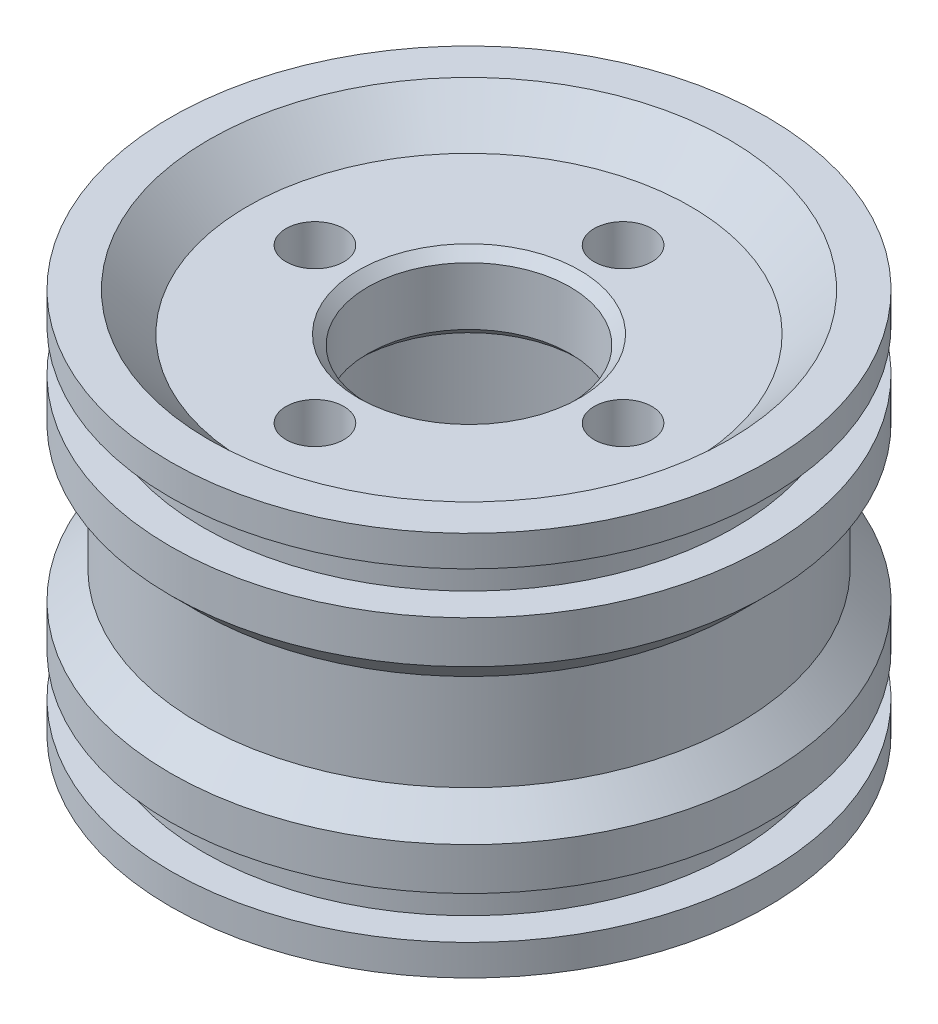
ISO-10303-21;
HEADER;
FILE_DESCRIPTION(('STEP AP214'),'2;1');
FILE_NAME('part.step','',(''),(''),'','','');
FILE_SCHEMA(('AUTOMOTIVE_DESIGN { 1 0 10303 214 1 1 1 1 }'));
ENDSEC;
DATA;
#1=APPLICATION_CONTEXT('core data for automotive mechanical design processes');
#2=APPLICATION_PROTOCOL_DEFINITION('international standard','automotive_design',2000,#1);
#3=PRODUCT_CONTEXT('',#1,'mechanical');
#4=PRODUCT('Part','Part','',(#3));
#5=PRODUCT_RELATED_PRODUCT_CATEGORY('part','',(#4));
#6=PRODUCT_DEFINITION_FORMATION('','',#4);
#7=PRODUCT_DEFINITION_CONTEXT('part definition',#1,'design');
#8=PRODUCT_DEFINITION('design','',#6,#7);
#9=PRODUCT_DEFINITION_SHAPE('','',#8);
#10=(LENGTH_UNIT() NAMED_UNIT(*) SI_UNIT(.MILLI.,.METRE.));
#11=(NAMED_UNIT(*) PLANE_ANGLE_UNIT() SI_UNIT($,.RADIAN.));
#12=(NAMED_UNIT(*) SI_UNIT($,.STERADIAN.) SOLID_ANGLE_UNIT());
#13=UNCERTAINTY_MEASURE_WITH_UNIT(LENGTH_MEASURE(1.E-05),#10,'distance_accuracy_value','');
#14=(GEOMETRIC_REPRESENTATION_CONTEXT(3) GLOBAL_UNCERTAINTY_ASSIGNED_CONTEXT((#13)) GLOBAL_UNIT_ASSIGNED_CONTEXT((#10,
#11,#12)) REPRESENTATION_CONTEXT('',''));
#15=CARTESIAN_POINT('',(0.,0.,0.));
#16=DIRECTION('',(0.,0.,1.));
#17=DIRECTION('',(1.,0.,0.));
#18=AXIS2_PLACEMENT_3D('',#15,#16,#17);
#19=CARTESIAN_POINT('',(0.,10.,0.));
#20=DIRECTION('',(0.,-1.,0.));
#21=DIRECTION('',(0.,0.,-1.));
#22=AXIS2_PLACEMENT_3D('',#19,#20,#21);
#23=CYLINDRICAL_SURFACE('',#22,15.5);
#24=CARTESIAN_POINT('',(0.,-4.,0.));
#25=DIRECTION('',(0.,-1.,0.));
#26=DIRECTION('',(0.,0.,-1.));
#27=AXIS2_PLACEMENT_3D('',#24,#25,#26);
#28=CIRCLE('',#27,15.5);
#29=CARTESIAN_POINT('',(0.,-4.,-15.5));
#30=VERTEX_POINT('',#29);
#31=EDGE_CURVE('E136',#30,#30,#28,.T.);
#32=ORIENTED_EDGE('',*,*,#31,.T.);
#33=EDGE_LOOP('',(#32));
#34=FACE_BOUND('',#33,.T.);
#35=CARTESIAN_POINT('',(0.,-6.2,0.));
#36=DIRECTION('',(0.,1.,0.));
#37=DIRECTION('',(0.,0.,1.));
#38=AXIS2_PLACEMENT_3D('',#35,#36,#37);
#39=CIRCLE('',#38,15.5);
#40=CARTESIAN_POINT('',(0.,-6.2,15.5));
#41=VERTEX_POINT('',#40);
#42=EDGE_CURVE('E116',#41,#41,#39,.T.);
#43=ORIENTED_EDGE('',*,*,#42,.T.);
#44=EDGE_LOOP('',(#43));
#45=FACE_BOUND('',#44,.T.);
#46=ADVANCED_FACE('F41',(#34,#45),#23,.T.);
#47=CARTESIAN_POINT('',(0.,-5.,0.));
#48=DIRECTION('',(0.,1.,0.));
#49=DIRECTION('',(0.,0.,1.));
#50=AXIS2_PLACEMENT_3D('',#47,#48,#49);
#51=CYLINDRICAL_SURFACE('',#50,5.25);
#52=CARTESIAN_POINT('',(0.,7.5,0.));
#53=DIRECTION('',(0.,1.,0.));
#54=DIRECTION('',(0.,0.,1.));
#55=AXIS2_PLACEMENT_3D('',#52,#53,#54);
#56=CIRCLE('',#55,5.25);
#57=CARTESIAN_POINT('',(0.,7.5,5.25));
#58=VERTEX_POINT('',#57);
#59=EDGE_CURVE('E57',#58,#58,#56,.T.);
#60=ORIENTED_EDGE('',*,*,#59,.T.);
#61=EDGE_LOOP('',(#60));
#62=FACE_BOUND('',#61,.T.);
#63=CARTESIAN_POINT('',(0.,4.5,0.));
#64=DIRECTION('',(0.,-1.,0.));
#65=DIRECTION('',(0.,0.,-1.));
#66=AXIS2_PLACEMENT_3D('',#63,#64,#65);
#67=CIRCLE('',#66,5.25);
#68=CARTESIAN_POINT('',(0.,4.5,-5.25));
#69=VERTEX_POINT('',#68);
#70=EDGE_CURVE('E62',#69,#69,#67,.T.);
#71=ORIENTED_EDGE('',*,*,#70,.T.);
#72=EDGE_LOOP('',(#71));
#73=FACE_BOUND('',#72,.T.);
#74=ADVANCED_FACE('F154',(#62,#73),#51,.F.);
#75=CARTESIAN_POINT('',(0.,4.,0.));
#76=DIRECTION('',(0.,-1.,0.));
#77=DIRECTION('',(0.,0.,-1.));
#78=AXIS2_PLACEMENT_3D('',#75,#76,#77);
#79=CIRCLE('',#78,15.5);
#80=CARTESIAN_POINT('',(0.,4.,-15.5));
#81=VERTEX_POINT('',#80);
#82=EDGE_CURVE('E143',#81,#81,#79,.T.);
#83=ORIENTED_EDGE('',*,*,#82,.F.);
#84=EDGE_LOOP('',(#83));
#85=FACE_BOUND('',#84,.T.);
#86=CARTESIAN_POINT('',(0.,6.2,0.));
#87=DIRECTION('',(0.,1.,0.));
#88=DIRECTION('',(0.,0.,1.));
#89=AXIS2_PLACEMENT_3D('',#86,#87,#88);
#90=CIRCLE('',#89,15.5);
#91=CARTESIAN_POINT('',(0.,6.2,15.5));
#92=VERTEX_POINT('',#91);
#93=EDGE_CURVE('E102',#92,#92,#90,.T.);
#94=ORIENTED_EDGE('',*,*,#93,.F.);
#95=EDGE_LOOP('',(#94));
#96=FACE_BOUND('',#95,.T.);
#97=ADVANCED_FACE('F150',(#85,#96),#23,.T.);
#98=CARTESIAN_POINT('',(15.5,6.2,0.));
#99=DIRECTION('',(0.,1.,0.));
#100=DIRECTION('',(0.,0.,1.));
#101=AXIS2_PLACEMENT_3D('',#98,#99,#100);
#102=PLANE('',#101);
#103=ORIENTED_EDGE('',*,*,#93,.T.);
#104=EDGE_LOOP('',(#103));
#105=FACE_BOUND('',#104,.T.);
#106=CARTESIAN_POINT('',(0.,6.2,0.));
#107=DIRECTION('',(0.,1.,0.));
#108=DIRECTION('',(0.,0.,1.));
#109=AXIS2_PLACEMENT_3D('',#106,#107,#108);
#110=CIRCLE('',#109,13.8);
#111=CARTESIAN_POINT('',(0.,6.2,13.8));
#112=VERTEX_POINT('',#111);
#113=EDGE_CURVE('E107',#112,#112,#110,.T.);
#114=ORIENTED_EDGE('',*,*,#113,.F.);
#115=EDGE_LOOP('',(#114));
#116=FACE_BOUND('',#115,.T.);
#117=ADVANCED_FACE('F153',(#105,#116),#102,.T.);
#118=CARTESIAN_POINT('',(0.,8.4,0.));
#119=DIRECTION('',(0.,1.,0.));
#120=DIRECTION('',(0.,0.,1.));
#121=AXIS2_PLACEMENT_3D('',#118,#119,#120);
#122=CYLINDRICAL_SURFACE('',#121,13.8);
#123=ORIENTED_EDGE('',*,*,#113,.T.);
#124=EDGE_LOOP('',(#123));
#125=FACE_BOUND('',#124,.T.);
#126=CARTESIAN_POINT('',(0.,8.4,0.));
#127=DIRECTION('',(0.,1.,0.));
#128=DIRECTION('',(0.,0.,1.));
#129=AXIS2_PLACEMENT_3D('',#126,#127,#128);
#130=CIRCLE('',#129,13.8);
#131=CARTESIAN_POINT('',(0.,8.4,13.8));
#132=VERTEX_POINT('',#131);
#133=EDGE_CURVE('E110',#132,#132,#130,.T.);
#134=ORIENTED_EDGE('',*,*,#133,.F.);
#135=EDGE_LOOP('',(#134));
#136=FACE_BOUND('',#135,.T.);
#137=ADVANCED_FACE('F161',(#125,#136),#122,.T.);
#138=CARTESIAN_POINT('',(15.5,8.4,0.));
#139=DIRECTION('',(0.,-1.,0.));
#140=DIRECTION('',(0.,0.,-1.));
#141=AXIS2_PLACEMENT_3D('',#138,#139,#140);
#142=PLANE('',#141);
#143=ORIENTED_EDGE('',*,*,#133,.T.);
#144=EDGE_LOOP('',(#143));
#145=FACE_BOUND('',#144,.T.);
#146=CARTESIAN_POINT('',(0.,8.4,0.));
#147=DIRECTION('',(0.,1.,0.));
#148=DIRECTION('',(0.,0.,1.));
#149=AXIS2_PLACEMENT_3D('',#146,#147,#148);
#150=CIRCLE('',#149,15.5);
#151=CARTESIAN_POINT('',(0.,8.4,15.5));
#152=VERTEX_POINT('',#151);
#153=EDGE_CURVE('E113',#152,#152,#150,.T.);
#154=ORIENTED_EDGE('',*,*,#153,.F.);
#155=EDGE_LOOP('',(#154));
#156=FACE_BOUND('',#155,.T.);
#157=ADVANCED_FACE('F167',(#145,#156),#142,.T.);
#158=CARTESIAN_POINT('',(0.,10.,0.));
#159=DIRECTION('',(0.,1.,0.));
#160=DIRECTION('',(0.,0.,1.));
#161=AXIS2_PLACEMENT_3D('',#158,#159,#160);
#162=PLANE('',#161);
#163=CARTESIAN_POINT('',(0.,10.,0.));
#164=DIRECTION('',(0.,1.,0.));
#165=DIRECTION('',(0.,0.,1.));
#166=AXIS2_PLACEMENT_3D('',#163,#164,#165);
#167=CIRCLE('',#166,13.5);
#168=CARTESIAN_POINT('',(0.,10.,13.5));
#169=VERTEX_POINT('',#168);
#170=EDGE_CURVE('E74',#169,#169,#167,.F.);
#171=ORIENTED_EDGE('',*,*,#170,.T.);
#172=EDGE_LOOP('',(#171));
#173=FACE_BOUND('',#172,.T.);
#174=CARTESIAN_POINT('',(0.,10.,0.));
#175=DIRECTION('',(0.,1.,0.));
#176=DIRECTION('',(0.,0.,1.));
#177=AXIS2_PLACEMENT_3D('',#174,#175,#176);
#178=CIRCLE('',#177,15.5);
#179=CARTESIAN_POINT('',(0.,10.,15.5));
#180=VERTEX_POINT('',#179);
#181=EDGE_CURVE('E98',#180,#180,#178,.T.);
#182=ORIENTED_EDGE('',*,*,#181,.T.);
#183=EDGE_LOOP('',(#182));
#184=FACE_BOUND('',#183,.T.);
#185=ADVANCED_FACE('F173',(#173,#184),#162,.T.);
#186=ORIENTED_EDGE('',*,*,#181,.F.);
#187=EDGE_LOOP('',(#186));
#188=FACE_BOUND('',#187,.T.);
#189=ORIENTED_EDGE('',*,*,#153,.T.);
#190=EDGE_LOOP('',(#189));
#191=FACE_BOUND('',#190,.T.);
#192=ADVANCED_FACE('F156',(#188,#191),#23,.T.);
#193=CARTESIAN_POINT('',(15.5,-6.2,0.));
#194=DIRECTION('',(0.,-1.,0.));
#195=DIRECTION('',(0.,0.,1.));
#196=AXIS2_PLACEMENT_3D('',#193,#194,#195);
#197=PLANE('',#196);
#198=ORIENTED_EDGE('',*,*,#42,.F.);
#199=EDGE_LOOP('',(#198));
#200=FACE_BOUND('',#199,.T.);
#201=CARTESIAN_POINT('',(0.,-6.2,0.));
#202=DIRECTION('',(0.,1.,0.));
#203=DIRECTION('',(0.,0.,1.));
#204=AXIS2_PLACEMENT_3D('',#201,#202,#203);
#205=CIRCLE('',#204,13.8);
#206=CARTESIAN_POINT('',(0.,-6.2,13.8));
#207=VERTEX_POINT('',#206);
#208=EDGE_CURVE('E119',#207,#207,#205,.T.);
#209=ORIENTED_EDGE('',*,*,#208,.T.);
#210=EDGE_LOOP('',(#209));
#211=FACE_BOUND('',#210,.T.);
#212=ADVANCED_FACE('F178',(#200,#211),#197,.T.);
#213=CARTESIAN_POINT('',(0.,-8.4,0.));
#214=DIRECTION('',(0.,-1.,0.));
#215=DIRECTION('',(0.,0.,1.));
#216=AXIS2_PLACEMENT_3D('',#213,#214,#215);
#217=CYLINDRICAL_SURFACE('',#216,13.8);
#218=ORIENTED_EDGE('',*,*,#208,.F.);
#219=EDGE_LOOP('',(#218));
#220=FACE_BOUND('',#219,.T.);
#221=CARTESIAN_POINT('',(0.,-8.4,0.));
#222=DIRECTION('',(0.,1.,0.));
#223=DIRECTION('',(0.,0.,1.));
#224=AXIS2_PLACEMENT_3D('',#221,#222,#223);
#225=CIRCLE('',#224,13.8);
#226=CARTESIAN_POINT('',(0.,-8.4,13.8));
#227=VERTEX_POINT('',#226);
#228=EDGE_CURVE('E122',#227,#227,#225,.T.);
#229=ORIENTED_EDGE('',*,*,#228,.T.);
#230=EDGE_LOOP('',(#229));
#231=FACE_BOUND('',#230,.T.);
#232=ADVANCED_FACE('F184',(#220,#231),#217,.T.);
#233=CARTESIAN_POINT('',(15.5,-8.4,0.));
#234=DIRECTION('',(0.,1.,0.));
#235=DIRECTION('',(0.,0.,-1.));
#236=AXIS2_PLACEMENT_3D('',#233,#234,#235);
#237=PLANE('',#236);
#238=ORIENTED_EDGE('',*,*,#228,.F.);
#239=EDGE_LOOP('',(#238));
#240=FACE_BOUND('',#239,.T.);
#241=CARTESIAN_POINT('',(0.,-8.4,0.));
#242=DIRECTION('',(0.,1.,0.));
#243=DIRECTION('',(0.,0.,1.));
#244=AXIS2_PLACEMENT_3D('',#241,#242,#243);
#245=CIRCLE('',#244,15.5);
#246=CARTESIAN_POINT('',(0.,-8.4,15.5));
#247=VERTEX_POINT('',#246);
#248=EDGE_CURVE('E125',#247,#247,#245,.T.);
#249=ORIENTED_EDGE('',*,*,#248,.T.);
#250=EDGE_LOOP('',(#249));
#251=FACE_BOUND('',#250,.T.);
#252=ADVANCED_FACE('F213',(#240,#251),#237,.T.);
#253=CARTESIAN_POINT('',(0.,-10.,0.));
#254=DIRECTION('',(0.,1.,0.));
#255=DIRECTION('',(0.,0.,1.));
#256=AXIS2_PLACEMENT_3D('',#253,#254,#255);
#257=PLANE('',#256);
#258=CARTESIAN_POINT('',(0.,-10.,0.));
#259=DIRECTION('',(0.,1.,0.));
#260=DIRECTION('',(0.,0.,1.));
#261=AXIS2_PLACEMENT_3D('',#258,#259,#260);
#262=CIRCLE('',#261,13.5);
#263=CARTESIAN_POINT('',(0.,-10.,13.5));
#264=VERTEX_POINT('',#263);
#265=EDGE_CURVE('E92',#264,#264,#262,.T.);
#266=ORIENTED_EDGE('',*,*,#265,.T.);
#267=EDGE_LOOP('',(#266));
#268=FACE_BOUND('',#267,.T.);
#269=CARTESIAN_POINT('',(0.,-10.,0.));
#270=DIRECTION('',(0.,1.,0.));
#271=DIRECTION('',(0.,0.,1.));
#272=AXIS2_PLACEMENT_3D('',#269,#270,#271);
#273=CIRCLE('',#272,15.5);
#274=CARTESIAN_POINT('',(0.,-10.,15.5));
#275=VERTEX_POINT('',#274);
#276=EDGE_CURVE('E99',#275,#275,#273,.T.);
#277=ORIENTED_EDGE('',*,*,#276,.F.);
#278=EDGE_LOOP('',(#277));
#279=FACE_BOUND('',#278,.T.);
#280=ADVANCED_FACE('F195',(#268,#279),#257,.F.);
#281=ORIENTED_EDGE('',*,*,#276,.T.);
#282=EDGE_LOOP('',(#281));
#283=FACE_BOUND('',#282,.T.);
#284=ORIENTED_EDGE('',*,*,#248,.F.);
#285=EDGE_LOOP('',(#284));
#286=FACE_BOUND('',#285,.T.);
#287=ADVANCED_FACE('F180',(#283,#286),#23,.T.);
#288=CARTESIAN_POINT('',(0.,4.,0.));
#289=DIRECTION('',(0.,-1.,0.));
#290=DIRECTION('',(0.,0.,-1.));
#291=AXIS2_PLACEMENT_3D('',#288,#289,#290);
#292=CYLINDRICAL_SURFACE('',#291,11.5);
#293=CARTESIAN_POINT('',(0.,3.50000000000001,0.));
#294=DIRECTION('',(0.,-1.,0.));
#295=DIRECTION('',(0.,0.,-1.));
#296=AXIS2_PLACEMENT_3D('',#293,#294,#295);
#297=CIRCLE('',#296,11.5);
#298=CARTESIAN_POINT('',(0.,3.50000000000001,-11.5));
#299=VERTEX_POINT('',#298);
#300=EDGE_CURVE('E10',#299,#299,#297,.F.);
#301=ORIENTED_EDGE('',*,*,#300,.T.);
#302=EDGE_LOOP('',(#301));
#303=FACE_BOUND('',#302,.T.);
#304=CARTESIAN_POINT('',(0.,-7.99999999999998,0.));
#305=DIRECTION('',(0.,1.,0.));
#306=DIRECTION('',(0.,0.,1.));
#307=AXIS2_PLACEMENT_3D('',#304,#305,#306);
#308=CIRCLE('',#307,11.5);
#309=CARTESIAN_POINT('',(0.,-7.99999999999998,11.5));
#310=VERTEX_POINT('',#309);
#311=EDGE_CURVE('E95',#310,#310,#308,.F.);
#312=ORIENTED_EDGE('',*,*,#311,.T.);
#313=EDGE_LOOP('',(#312));
#314=FACE_BOUND('',#313,.T.);
#315=ADVANCED_FACE('F194',(#303,#314),#292,.F.);
#316=CARTESIAN_POINT('',(0.,4.,0.));
#317=DIRECTION('',(0.,-1.,0.));
#318=DIRECTION('',(0.,0.,-1.));
#319=AXIS2_PLACEMENT_3D('',#316,#317,#318);
#320=PLANE('',#319);
#321=CARTESIAN_POINT('',(0.,4.,0.));
#322=DIRECTION('',(0.,-1.,0.));
#323=DIRECTION('',(0.,0.,-1.));
#324=AXIS2_PLACEMENT_3D('',#321,#322,#323);
#325=CIRCLE('',#324,5.75000000000001);
#326=CARTESIAN_POINT('',(0.,4.,-5.75000000000001));
#327=VERTEX_POINT('',#326);
#328=EDGE_CURVE('E49',#327,#327,#325,.F.);
#329=ORIENTED_EDGE('',*,*,#328,.T.);
#330=EDGE_LOOP('',(#329));
#331=FACE_BOUND('',#330,.T.);
#332=CARTESIAN_POINT('',(0.,4.,0.));
#333=DIRECTION('',(0.,-1.,0.));
#334=DIRECTION('',(0.,0.,-1.));
#335=AXIS2_PLACEMENT_3D('',#332,#333,#334);
#336=CIRCLE('',#335,11.);
#337=CARTESIAN_POINT('',(0.,4.,-11.));
#338=VERTEX_POINT('',#337);
#339=EDGE_CURVE('E53',#338,#338,#336,.T.);
#340=ORIENTED_EDGE('',*,*,#339,.T.);
#341=EDGE_LOOP('',(#340));
#342=FACE_BOUND('',#341,.T.);
#343=CARTESIAN_POINT('',(0.,4.,8.));
#344=DIRECTION('',(0.,-1.,0.));
#345=DIRECTION('',(-1.,0.,0.));
#346=AXIS2_PLACEMENT_3D('',#343,#344,#345);
#347=CIRCLE('',#346,1.5);
#348=CARTESIAN_POINT('',(-1.49999999999997,4.,8.00000000000001));
#349=VERTEX_POINT('',#348);
#350=EDGE_CURVE('E85',#349,#349,#347,.T.);
#351=ORIENTED_EDGE('',*,*,#350,.F.);
#352=EDGE_LOOP('',(#351));
#353=FACE_BOUND('',#352,.T.);
#354=CARTESIAN_POINT('',(8.,4.,0.));
#355=DIRECTION('',(0.,-1.,0.));
#356=DIRECTION('',(0.,0.,1.));
#357=AXIS2_PLACEMENT_3D('',#354,#355,#356);
#358=CIRCLE('',#357,1.5);
#359=CARTESIAN_POINT('',(8.,4.,1.5));
#360=VERTEX_POINT('',#359);
#361=EDGE_CURVE('E135',#360,#360,#358,.T.);
#362=ORIENTED_EDGE('',*,*,#361,.F.);
#363=EDGE_LOOP('',(#362));
#364=FACE_BOUND('',#363,.T.);
#365=CARTESIAN_POINT('',(0.,4.,-8.));
#366=DIRECTION('',(0.,-1.,0.));
#367=DIRECTION('',(1.,0.,0.));
#368=AXIS2_PLACEMENT_3D('',#365,#366,#367);
#369=CIRCLE('',#368,1.5);
#370=CARTESIAN_POINT('',(1.49999999999992,4.,-8.00000000000002));
#371=VERTEX_POINT('',#370);
#372=EDGE_CURVE('E132',#371,#371,#369,.T.);
#373=ORIENTED_EDGE('',*,*,#372,.F.);
#374=EDGE_LOOP('',(#373));
#375=FACE_BOUND('',#374,.T.);
#376=CARTESIAN_POINT('',(-8.,4.,0.));
#377=DIRECTION('',(0.,-1.,0.));
#378=DIRECTION('',(0.,0.,-1.));
#379=AXIS2_PLACEMENT_3D('',#376,#377,#378);
#380=CIRCLE('',#379,1.5);
#381=CARTESIAN_POINT('',(-8.,4.,-1.5));
#382=VERTEX_POINT('',#381);
#383=EDGE_CURVE('E78',#382,#382,#380,.T.);
#384=ORIENTED_EDGE('',*,*,#383,.F.);
#385=EDGE_LOOP('',(#384));
#386=FACE_BOUND('',#385,.T.);
#387=ADVANCED_FACE('F229',(#331,#342,#353,#364,#375,#386),#320,.T.);
#388=CARTESIAN_POINT('',(0.,-7.99999999999998,0.));
#389=DIRECTION('',(0.,-1.,0.));
#390=DIRECTION('',(0.,0.,-1.));
#391=AXIS2_PLACEMENT_3D('',#388,#389,#390);
#392=CONICAL_SURFACE('',#391,11.5,0.785398163397449);
#393=ORIENTED_EDGE('',*,*,#265,.F.);
#394=EDGE_LOOP('',(#393));
#395=FACE_BOUND('',#394,.T.);
#396=ORIENTED_EDGE('',*,*,#311,.F.);
#397=EDGE_LOOP('',(#396));
#398=FACE_BOUND('',#397,.T.);
#399=ADVANCED_FACE('F231',(#395,#398),#392,.F.);
#400=CARTESIAN_POINT('',(0.,8.,0.));
#401=DIRECTION('',(0.,1.,0.));
#402=DIRECTION('',(0.,0.,1.));
#403=AXIS2_PLACEMENT_3D('',#400,#401,#402);
#404=PLANE('',#403);
#405=CARTESIAN_POINT('',(0.,8.,0.));
#406=DIRECTION('',(0.,1.,0.));
#407=DIRECTION('',(0.,0.,1.));
#408=AXIS2_PLACEMENT_3D('',#405,#406,#407);
#409=CIRCLE('',#408,5.75);
#410=CARTESIAN_POINT('',(0.,8.,5.75));
#411=VERTEX_POINT('',#410);
#412=EDGE_CURVE('E65',#411,#411,#409,.F.);
#413=ORIENTED_EDGE('',*,*,#412,.T.);
#414=EDGE_LOOP('',(#413));
#415=FACE_BOUND('',#414,.T.);
#416=CARTESIAN_POINT('',(0.,8.,8.));
#417=DIRECTION('',(0.,1.,0.));
#418=DIRECTION('',(0.,0.,1.));
#419=AXIS2_PLACEMENT_3D('',#416,#417,#418);
#420=CIRCLE('',#419,1.5);
#421=CARTESIAN_POINT('',(0.,8.,9.5));
#422=VERTEX_POINT('',#421);
#423=EDGE_CURVE('E75',#422,#422,#420,.T.);
#424=ORIENTED_EDGE('',*,*,#423,.F.);
#425=EDGE_LOOP('',(#424));
#426=FACE_BOUND('',#425,.T.);
#427=CARTESIAN_POINT('',(8.,8.,0.));
#428=DIRECTION('',(0.,1.,0.));
#429=DIRECTION('',(0.,0.,1.));
#430=AXIS2_PLACEMENT_3D('',#427,#428,#429);
#431=CIRCLE('',#430,1.5);
#432=CARTESIAN_POINT('',(8.,8.,1.5));
#433=VERTEX_POINT('',#432);
#434=EDGE_CURVE('E79',#433,#433,#431,.T.);
#435=ORIENTED_EDGE('',*,*,#434,.F.);
#436=EDGE_LOOP('',(#435));
#437=FACE_BOUND('',#436,.T.);
#438=CARTESIAN_POINT('',(0.,8.,-8.));
#439=DIRECTION('',(0.,1.,0.));
#440=DIRECTION('',(0.,0.,1.));
#441=AXIS2_PLACEMENT_3D('',#438,#439,#440);
#442=CIRCLE('',#441,1.5);
#443=CARTESIAN_POINT('',(0.,8.,-6.5));
#444=VERTEX_POINT('',#443);
#445=EDGE_CURVE('E82',#444,#444,#442,.T.);
#446=ORIENTED_EDGE('',*,*,#445,.F.);
#447=EDGE_LOOP('',(#446));
#448=FACE_BOUND('',#447,.T.);
#449=CARTESIAN_POINT('',(-8.,8.,0.));
#450=DIRECTION('',(0.,1.,0.));
#451=DIRECTION('',(0.,0.,1.));
#452=AXIS2_PLACEMENT_3D('',#449,#450,#451);
#453=CIRCLE('',#452,1.5);
#454=CARTESIAN_POINT('',(-8.,8.,1.5));
#455=VERTEX_POINT('',#454);
#456=EDGE_CURVE('E86',#455,#455,#453,.T.);
#457=ORIENTED_EDGE('',*,*,#456,.F.);
#458=EDGE_LOOP('',(#457));
#459=FACE_BOUND('',#458,.T.);
#460=CARTESIAN_POINT('',(0.,8.,0.));
#461=DIRECTION('',(0.,1.,0.));
#462=DIRECTION('',(0.,0.,1.));
#463=AXIS2_PLACEMENT_3D('',#460,#461,#462);
#464=CIRCLE('',#463,11.5);
#465=CARTESIAN_POINT('',(0.,8.,11.5));
#466=VERTEX_POINT('',#465);
#467=EDGE_CURVE('E89',#466,#466,#464,.T.);
#468=ORIENTED_EDGE('',*,*,#467,.T.);
#469=EDGE_LOOP('',(#468));
#470=FACE_BOUND('',#469,.T.);
#471=ADVANCED_FACE('F233',(#415,#426,#437,#448,#459,#470),#404,.T.);
#472=CARTESIAN_POINT('',(0.,8.,0.));
#473=DIRECTION('',(0.,1.,0.));
#474=DIRECTION('',(0.,0.,1.));
#475=AXIS2_PLACEMENT_3D('',#472,#473,#474);
#476=CONICAL_SURFACE('',#475,11.5,0.78539816339745);
#477=ORIENTED_EDGE('',*,*,#170,.F.);
#478=EDGE_LOOP('',(#477));
#479=FACE_BOUND('',#478,.T.);
#480=ORIENTED_EDGE('',*,*,#467,.F.);
#481=EDGE_LOOP('',(#480));
#482=FACE_BOUND('',#481,.T.);
#483=ADVANCED_FACE('F236',(#479,#482),#476,.F.);
#484=CARTESIAN_POINT('',(-8.,14.,0.));
#485=DIRECTION('',(0.,-1.,0.));
#486=DIRECTION('',(0.,0.,-1.));
#487=AXIS2_PLACEMENT_3D('',#484,#485,#486);
#488=CYLINDRICAL_SURFACE('',#487,1.5);
#489=ORIENTED_EDGE('',*,*,#456,.T.);
#490=EDGE_LOOP('',(#489));
#491=FACE_BOUND('',#490,.T.);
#492=ORIENTED_EDGE('',*,*,#383,.T.);
#493=EDGE_LOOP('',(#492));
#494=FACE_BOUND('',#493,.T.);
#495=ADVANCED_FACE('F238',(#491,#494),#488,.F.);
#496=CARTESIAN_POINT('',(0.,14.,-8.));
#497=DIRECTION('',(0.,-1.,0.));
#498=DIRECTION('',(0.,0.,-1.));
#499=AXIS2_PLACEMENT_3D('',#496,#497,#498);
#500=CYLINDRICAL_SURFACE('',#499,1.5);
#501=ORIENTED_EDGE('',*,*,#445,.T.);
#502=EDGE_LOOP('',(#501));
#503=FACE_BOUND('',#502,.T.);
#504=ORIENTED_EDGE('',*,*,#372,.T.);
#505=EDGE_LOOP('',(#504));
#506=FACE_BOUND('',#505,.T.);
#507=ADVANCED_FACE('F241',(#503,#506),#500,.F.);
#508=CARTESIAN_POINT('',(8.,14.,0.));
#509=DIRECTION('',(0.,-1.,0.));
#510=DIRECTION('',(0.,0.,-1.));
#511=AXIS2_PLACEMENT_3D('',#508,#509,#510);
#512=CYLINDRICAL_SURFACE('',#511,1.5);
#513=ORIENTED_EDGE('',*,*,#434,.T.);
#514=EDGE_LOOP('',(#513));
#515=FACE_BOUND('',#514,.T.);
#516=ORIENTED_EDGE('',*,*,#361,.T.);
#517=EDGE_LOOP('',(#516));
#518=FACE_BOUND('',#517,.T.);
#519=ADVANCED_FACE('F245',(#515,#518),#512,.F.);
#520=CARTESIAN_POINT('',(0.,14.,8.));
#521=DIRECTION('',(0.,-1.,0.));
#522=DIRECTION('',(0.,0.,-1.));
#523=AXIS2_PLACEMENT_3D('',#520,#521,#522);
#524=CYLINDRICAL_SURFACE('',#523,1.5);
#525=ORIENTED_EDGE('',*,*,#423,.T.);
#526=EDGE_LOOP('',(#525));
#527=FACE_BOUND('',#526,.T.);
#528=ORIENTED_EDGE('',*,*,#350,.T.);
#529=EDGE_LOOP('',(#528));
#530=FACE_BOUND('',#529,.T.);
#531=ADVANCED_FACE('F249',(#527,#530),#524,.F.);
#532=CARTESIAN_POINT('',(0.,4.,0.));
#533=DIRECTION('',(0.,-1.,0.));
#534=DIRECTION('',(0.,0.,-1.));
#535=AXIS2_PLACEMENT_3D('',#532,#533,#534);
#536=CYLINDRICAL_SURFACE('',#535,14.);
#537=CARTESIAN_POINT('',(0.,2.49999999999999,0.));
#538=DIRECTION('',(0.,1.,0.));
#539=DIRECTION('',(0.,0.,1.));
#540=AXIS2_PLACEMENT_3D('',#537,#538,#539);
#541=CIRCLE('',#540,14.);
#542=CARTESIAN_POINT('',(0.,2.49999999999999,14.));
#543=VERTEX_POINT('',#542);
#544=EDGE_CURVE('E68',#543,#543,#541,.F.);
#545=ORIENTED_EDGE('',*,*,#544,.T.);
#546=EDGE_LOOP('',(#545));
#547=FACE_BOUND('',#546,.T.);
#548=CARTESIAN_POINT('',(0.,-2.50000000000001,0.));
#549=DIRECTION('',(0.,-1.,0.));
#550=DIRECTION('',(0.,0.,-1.));
#551=AXIS2_PLACEMENT_3D('',#548,#549,#550);
#552=CIRCLE('',#551,14.);
#553=CARTESIAN_POINT('',(0.,-2.50000000000001,-14.));
#554=VERTEX_POINT('',#553);
#555=EDGE_CURVE('E71',#554,#554,#552,.F.);
#556=ORIENTED_EDGE('',*,*,#555,.T.);
#557=EDGE_LOOP('',(#556));
#558=FACE_BOUND('',#557,.T.);
#559=ADVANCED_FACE('F252',(#547,#558),#536,.T.);
#560=CARTESIAN_POINT('',(0.,2.49999999999999,0.));
#561=DIRECTION('',(0.,1.,0.));
#562=DIRECTION('',(0.,0.,1.));
#563=AXIS2_PLACEMENT_3D('',#560,#561,#562);
#564=CONICAL_SURFACE('',#563,14.,0.785398163397443);
#565=ORIENTED_EDGE('',*,*,#82,.T.);
#566=EDGE_LOOP('',(#565));
#567=FACE_BOUND('',#566,.T.);
#568=ORIENTED_EDGE('',*,*,#544,.F.);
#569=EDGE_LOOP('',(#568));
#570=FACE_BOUND('',#569,.T.);
#571=ADVANCED_FACE('F147',(#567,#570),#564,.T.);
#572=CARTESIAN_POINT('',(0.,-4.,0.));
#573=DIRECTION('',(0.,-1.,0.));
#574=DIRECTION('',(0.,0.,-1.));
#575=AXIS2_PLACEMENT_3D('',#572,#573,#574);
#576=CONICAL_SURFACE('',#575,15.5,0.785398163397453);
#577=ORIENTED_EDGE('',*,*,#555,.F.);
#578=EDGE_LOOP('',(#577));
#579=FACE_BOUND('',#578,.T.);
#580=ORIENTED_EDGE('',*,*,#31,.F.);
#581=EDGE_LOOP('',(#580));
#582=FACE_BOUND('',#581,.T.);
#583=ADVANCED_FACE('F259',(#579,#582),#576,.T.);
#584=CARTESIAN_POINT('',(0.,8.,0.));
#585=DIRECTION('',(0.,1.,0.));
#586=DIRECTION('',(0.,0.,1.));
#587=AXIS2_PLACEMENT_3D('',#584,#585,#586);
#588=CONICAL_SURFACE('',#587,5.75,0.785398163397447);
#589=ORIENTED_EDGE('',*,*,#59,.F.);
#590=EDGE_LOOP('',(#589));
#591=FACE_BOUND('',#590,.T.);
#592=ORIENTED_EDGE('',*,*,#412,.F.);
#593=EDGE_LOOP('',(#592));
#594=FACE_BOUND('',#593,.T.);
#595=ADVANCED_FACE('F267',(#591,#594),#588,.F.);
#596=CARTESIAN_POINT('',(0.,4.5,0.));
#597=DIRECTION('',(0.,-1.,0.));
#598=DIRECTION('',(0.,0.,-1.));
#599=AXIS2_PLACEMENT_3D('',#596,#597,#598);
#600=CONICAL_SURFACE('',#599,5.25,0.785398163397458);
#601=ORIENTED_EDGE('',*,*,#328,.F.);
#602=EDGE_LOOP('',(#601));
#603=FACE_BOUND('',#602,.T.);
#604=ORIENTED_EDGE('',*,*,#70,.F.);
#605=EDGE_LOOP('',(#604));
#606=FACE_BOUND('',#605,.T.);
#607=ADVANCED_FACE('F272',(#603,#606),#600,.F.);
#608=CARTESIAN_POINT('',(0.,4.,0.));
#609=DIRECTION('',(0.,-1.,0.));
#610=DIRECTION('',(0.,0.,-1.));
#611=AXIS2_PLACEMENT_3D('',#608,#609,#610);
#612=CONICAL_SURFACE('',#611,11.,0.785398163397457);
#613=ORIENTED_EDGE('',*,*,#300,.F.);
#614=EDGE_LOOP('',(#613));
#615=FACE_BOUND('',#614,.T.);
#616=ORIENTED_EDGE('',*,*,#339,.F.);
#617=EDGE_LOOP('',(#616));
#618=FACE_BOUND('',#617,.T.);
#619=ADVANCED_FACE('F44',(#615,#618),#612,.F.);
#620=CLOSED_SHELL('',(#46,#74,#97,#117,#137,#157,#185,#192,#212,#232,#252,#280,#287,#315,#387,
#399,#471,#483,#495,#507,#519,#531,#559,#571,#583,#595,#607,#619));
#621=MANIFOLD_SOLID_BREP('B2',#620);
#622=ADVANCED_BREP_SHAPE_REPRESENTATION('',(#18,#621),#14);
#623=SHAPE_DEFINITION_REPRESENTATION(#9,#622);
ENDSEC;
END-ISO-10303-21;
